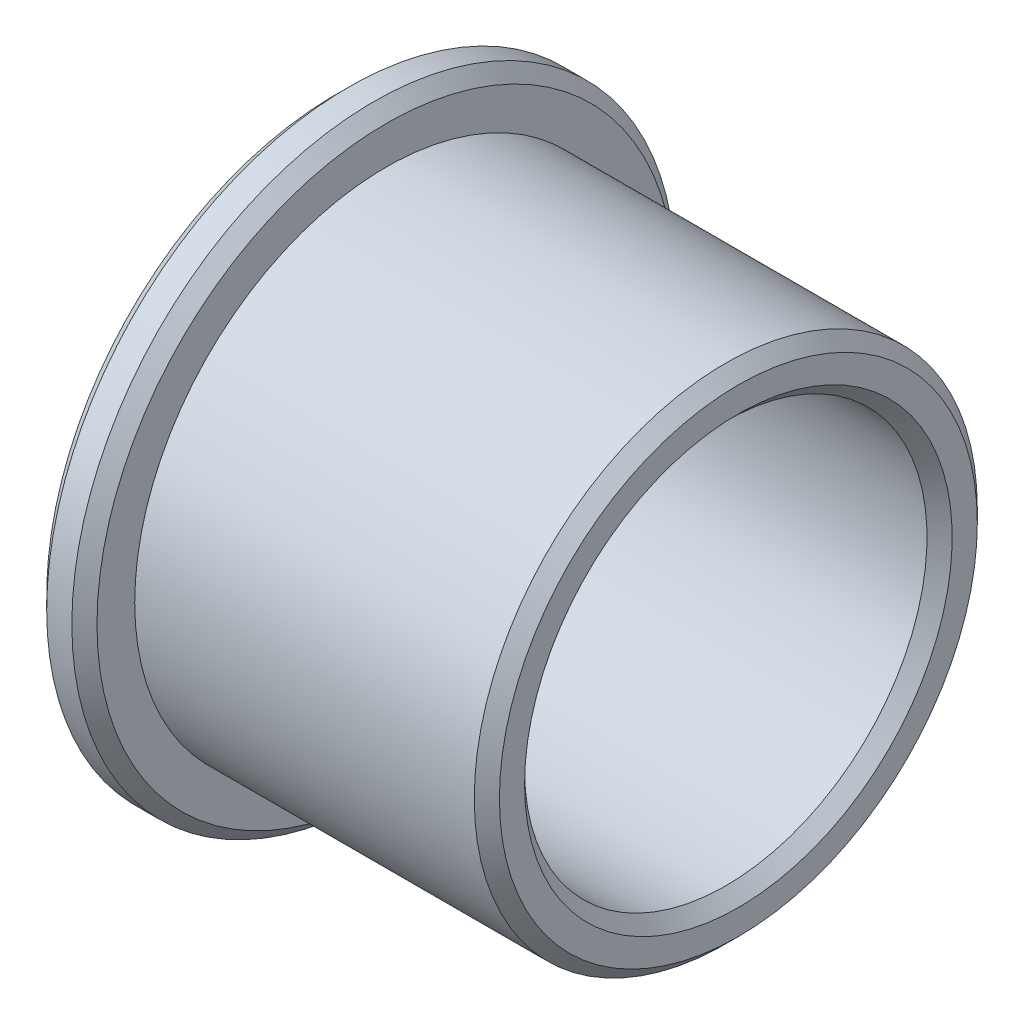
ISO-10303-21;
HEADER;
FILE_DESCRIPTION(('STEP AP214'),'2;1');
FILE_NAME('part.step','',(''),(''),'','','');
FILE_SCHEMA(('AUTOMOTIVE_DESIGN { 1 0 10303 214 1 1 1 1 }'));
ENDSEC;
DATA;
#1=APPLICATION_CONTEXT('core data for automotive mechanical design processes');
#2=APPLICATION_PROTOCOL_DEFINITION('international standard','automotive_design',2000,#1);
#3=PRODUCT_CONTEXT('',#1,'mechanical');
#4=PRODUCT('Part','Part','',(#3));
#5=PRODUCT_RELATED_PRODUCT_CATEGORY('part','',(#4));
#6=PRODUCT_DEFINITION_FORMATION('','',#4);
#7=PRODUCT_DEFINITION_CONTEXT('part definition',#1,'design');
#8=PRODUCT_DEFINITION('design','',#6,#7);
#9=PRODUCT_DEFINITION_SHAPE('','',#8);
#10=(LENGTH_UNIT() NAMED_UNIT(*) SI_UNIT(.MILLI.,.METRE.));
#11=(NAMED_UNIT(*) PLANE_ANGLE_UNIT() SI_UNIT($,.RADIAN.));
#12=(NAMED_UNIT(*) SI_UNIT($,.STERADIAN.) SOLID_ANGLE_UNIT());
#13=UNCERTAINTY_MEASURE_WITH_UNIT(LENGTH_MEASURE(1.E-05),#10,'distance_accuracy_value','');
#14=(GEOMETRIC_REPRESENTATION_CONTEXT(3) GLOBAL_UNCERTAINTY_ASSIGNED_CONTEXT((#13)) GLOBAL_UNIT_ASSIGNED_CONTEXT((#10,
#11,#12)) REPRESENTATION_CONTEXT('',''));
#15=CARTESIAN_POINT('',(0.,0.,0.));
#16=DIRECTION('',(0.,0.,1.));
#17=DIRECTION('',(1.,0.,0.));
#18=AXIS2_PLACEMENT_3D('',#15,#16,#17);
#19=CARTESIAN_POINT('',(8.,0.,-4.));
#20=DIRECTION('',(-1.,0.,0.));
#21=DIRECTION('',(0.,0.,1.));
#22=AXIS2_PLACEMENT_3D('',#19,#20,#21);
#23=PLANE('',#22);
#24=CARTESIAN_POINT('',(8.,0.,0.));
#25=DIRECTION('',(-1.,0.,0.));
#26=DIRECTION('',(0.,0.,1.));
#27=AXIS2_PLACEMENT_3D('',#24,#25,#26);
#28=CIRCLE('',#27,4.25);
#29=CARTESIAN_POINT('',(8.,0.,4.25));
#30=VERTEX_POINT('',#29);
#31=EDGE_CURVE('E37',#30,#30,#28,.T.);
#32=ORIENTED_EDGE('',*,*,#31,.T.);
#33=EDGE_LOOP('',(#32));
#34=FACE_BOUND('',#33,.T.);
#35=CARTESIAN_POINT('',(8.,0.,0.));
#36=DIRECTION('',(-1.,0.,0.));
#37=DIRECTION('',(0.,0.,1.));
#38=AXIS2_PLACEMENT_3D('',#35,#36,#37);
#39=CIRCLE('',#38,4.75);
#40=CARTESIAN_POINT('',(8.,0.,4.75));
#41=VERTEX_POINT('',#40);
#42=EDGE_CURVE('E41',#41,#41,#39,.F.);
#43=ORIENTED_EDGE('',*,*,#42,.T.);
#44=EDGE_LOOP('',(#43));
#45=FACE_BOUND('',#44,.T.);
#46=ADVANCED_FACE('F30',(#34,#45),#23,.F.);
#47=CARTESIAN_POINT('',(-2.31578947368421,0.,0.));
#48=DIRECTION('',(-1.,0.,0.));
#49=DIRECTION('',(0.,0.,1.));
#50=AXIS2_PLACEMENT_3D('',#47,#48,#49);
#51=CYLINDRICAL_SURFACE('',#50,5.);
#52=CARTESIAN_POINT('',(7.75,0.,0.));
#53=DIRECTION('',(-1.,0.,0.));
#54=DIRECTION('',(0.,0.,1.));
#55=AXIS2_PLACEMENT_3D('',#52,#53,#54);
#56=CIRCLE('',#55,5.);
#57=CARTESIAN_POINT('',(7.75,0.,5.));
#58=VERTEX_POINT('',#57);
#59=EDGE_CURVE('E10',#58,#58,#56,.T.);
#60=ORIENTED_EDGE('',*,*,#59,.T.);
#61=EDGE_LOOP('',(#60));
#62=FACE_BOUND('',#61,.T.);
#63=CARTESIAN_POINT('',(0.999999999999999,0.,0.));
#64=DIRECTION('',(-1.,0.,0.));
#65=DIRECTION('',(0.,0.,1.));
#66=AXIS2_PLACEMENT_3D('',#63,#64,#65);
#67=CIRCLE('',#66,5.);
#68=CARTESIAN_POINT('',(0.999999999999999,0.,5.));
#69=VERTEX_POINT('',#68);
#70=EDGE_CURVE('E68',#69,#69,#67,.T.);
#71=ORIENTED_EDGE('',*,*,#70,.F.);
#72=EDGE_LOOP('',(#71));
#73=FACE_BOUND('',#72,.T.);
#74=ADVANCED_FACE('F74',(#62,#73),#51,.T.);
#75=CARTESIAN_POINT('',(0.999999999999999,0.,-5.));
#76=DIRECTION('',(-1.,0.,0.));
#77=DIRECTION('',(0.,0.,1.));
#78=AXIS2_PLACEMENT_3D('',#75,#76,#77);
#79=PLANE('',#78);
#80=CARTESIAN_POINT('',(0.999999999999999,0.,0.));
#81=DIRECTION('',(-1.,0.,0.));
#82=DIRECTION('',(0.,0.,1.));
#83=AXIS2_PLACEMENT_3D('',#80,#81,#82);
#84=CIRCLE('',#83,5.75);
#85=CARTESIAN_POINT('',(0.999999999999999,0.,5.75));
#86=VERTEX_POINT('',#85);
#87=EDGE_CURVE('E53',#86,#86,#84,.F.);
#88=ORIENTED_EDGE('',*,*,#87,.T.);
#89=EDGE_LOOP('',(#88));
#90=FACE_BOUND('',#89,.T.);
#91=ORIENTED_EDGE('',*,*,#70,.T.);
#92=EDGE_LOOP('',(#91));
#93=FACE_BOUND('',#92,.T.);
#94=ADVANCED_FACE('F72',(#90,#93),#79,.F.);
#95=CARTESIAN_POINT('',(-2.31578947368421,0.,0.));
#96=DIRECTION('',(-1.,0.,0.));
#97=DIRECTION('',(0.,0.,1.));
#98=AXIS2_PLACEMENT_3D('',#95,#96,#97);
#99=CYLINDRICAL_SURFACE('',#98,6.);
#100=CARTESIAN_POINT('',(0.250000000000004,0.,0.));
#101=DIRECTION('',(1.,0.,0.));
#102=DIRECTION('',(0.,0.,-1.));
#103=AXIS2_PLACEMENT_3D('',#100,#101,#102);
#104=CIRCLE('',#103,6.);
#105=CARTESIAN_POINT('',(0.250000000000004,0.,-6.));
#106=VERTEX_POINT('',#105);
#107=EDGE_CURVE('E56',#106,#106,#104,.T.);
#108=ORIENTED_EDGE('',*,*,#107,.T.);
#109=EDGE_LOOP('',(#108));
#110=FACE_BOUND('',#109,.T.);
#111=CARTESIAN_POINT('',(0.750000000000005,0.,0.));
#112=DIRECTION('',(-1.,0.,0.));
#113=DIRECTION('',(0.,0.,1.));
#114=AXIS2_PLACEMENT_3D('',#111,#112,#113);
#115=CIRCLE('',#114,6.);
#116=CARTESIAN_POINT('',(0.750000000000005,0.,6.));
#117=VERTEX_POINT('',#116);
#118=EDGE_CURVE('E59',#117,#117,#115,.T.);
#119=ORIENTED_EDGE('',*,*,#118,.T.);
#120=EDGE_LOOP('',(#119));
#121=FACE_BOUND('',#120,.T.);
#122=ADVANCED_FACE('F81',(#110,#121),#99,.T.);
#123=CARTESIAN_POINT('',(0.,0.,-6.));
#124=DIRECTION('',(1.,0.,0.));
#125=DIRECTION('',(0.,0.,-1.));
#126=AXIS2_PLACEMENT_3D('',#123,#124,#125);
#127=PLANE('',#126);
#128=CARTESIAN_POINT('',(0.,0.,0.));
#129=DIRECTION('',(1.,0.,0.));
#130=DIRECTION('',(0.,0.,-1.));
#131=AXIS2_PLACEMENT_3D('',#128,#129,#130);
#132=CIRCLE('',#131,5.75);
#133=CARTESIAN_POINT('',(0.,0.,-5.75));
#134=VERTEX_POINT('',#133);
#135=EDGE_CURVE('E62',#134,#134,#132,.F.);
#136=ORIENTED_EDGE('',*,*,#135,.T.);
#137=EDGE_LOOP('',(#136));
#138=FACE_BOUND('',#137,.T.);
#139=CARTESIAN_POINT('',(0.,0.,0.));
#140=DIRECTION('',(1.,0.,0.));
#141=DIRECTION('',(0.,0.,-1.));
#142=AXIS2_PLACEMENT_3D('',#139,#140,#141);
#143=CIRCLE('',#142,4.25);
#144=CARTESIAN_POINT('',(0.,0.,-4.25));
#145=VERTEX_POINT('',#144);
#146=EDGE_CURVE('E65',#145,#145,#143,.T.);
#147=ORIENTED_EDGE('',*,*,#146,.T.);
#148=EDGE_LOOP('',(#147));
#149=FACE_BOUND('',#148,.T.);
#150=ADVANCED_FACE('F110',(#138,#149),#127,.F.);
#151=CARTESIAN_POINT('',(-2.31578947368421,0.,0.));
#152=DIRECTION('',(-1.,0.,0.));
#153=DIRECTION('',(0.,0.,1.));
#154=AXIS2_PLACEMENT_3D('',#151,#152,#153);
#155=CYLINDRICAL_SURFACE('',#154,4.);
#156=CARTESIAN_POINT('',(0.250000000000003,0.,0.));
#157=DIRECTION('',(1.,0.,0.));
#158=DIRECTION('',(0.,0.,-1.));
#159=AXIS2_PLACEMENT_3D('',#156,#157,#158);
#160=CIRCLE('',#159,4.);
#161=CARTESIAN_POINT('',(0.250000000000003,0.,-4.));
#162=VERTEX_POINT('',#161);
#163=EDGE_CURVE('E45',#162,#162,#160,.F.);
#164=ORIENTED_EDGE('',*,*,#163,.T.);
#165=EDGE_LOOP('',(#164));
#166=FACE_BOUND('',#165,.T.);
#167=CARTESIAN_POINT('',(7.75,0.,0.));
#168=DIRECTION('',(-1.,0.,0.));
#169=DIRECTION('',(0.,0.,1.));
#170=AXIS2_PLACEMENT_3D('',#167,#168,#169);
#171=CIRCLE('',#170,4.);
#172=CARTESIAN_POINT('',(7.75,0.,4.));
#173=VERTEX_POINT('',#172);
#174=EDGE_CURVE('E50',#173,#173,#171,.F.);
#175=ORIENTED_EDGE('',*,*,#174,.T.);
#176=EDGE_LOOP('',(#175));
#177=FACE_BOUND('',#176,.T.);
#178=ADVANCED_FACE('F91',(#166,#177),#155,.F.);
#179=CARTESIAN_POINT('',(0.,0.,0.));
#180=DIRECTION('',(1.,0.,0.));
#181=DIRECTION('',(0.,0.,-1.));
#182=AXIS2_PLACEMENT_3D('',#179,#180,#181);
#183=CONICAL_SURFACE('',#182,5.75,0.785398163397444);
#184=ORIENTED_EDGE('',*,*,#107,.F.);
#185=EDGE_LOOP('',(#184));
#186=FACE_BOUND('',#185,.T.);
#187=ORIENTED_EDGE('',*,*,#135,.F.);
#188=EDGE_LOOP('',(#187));
#189=FACE_BOUND('',#188,.T.);
#190=ADVANCED_FACE('F87',(#186,#189),#183,.T.);
#191=CARTESIAN_POINT('',(0.750000000000005,0.,0.));
#192=DIRECTION('',(-1.,0.,0.));
#193=DIRECTION('',(0.,0.,1.));
#194=AXIS2_PLACEMENT_3D('',#191,#192,#193);
#195=CONICAL_SURFACE('',#194,6.,0.785398163397452);
#196=ORIENTED_EDGE('',*,*,#87,.F.);
#197=EDGE_LOOP('',(#196));
#198=FACE_BOUND('',#197,.T.);
#199=ORIENTED_EDGE('',*,*,#118,.F.);
#200=EDGE_LOOP('',(#199));
#201=FACE_BOUND('',#200,.T.);
#202=ADVANCED_FACE('F90',(#198,#201),#195,.T.);
#203=CARTESIAN_POINT('',(0.250000000000003,0.,0.));
#204=DIRECTION('',(-1.,0.,0.));
#205=DIRECTION('',(0.,0.,1.));
#206=AXIS2_PLACEMENT_3D('',#203,#204,#205);
#207=CONICAL_SURFACE('',#206,4.,0.785398163397447);
#208=ORIENTED_EDGE('',*,*,#146,.F.);
#209=EDGE_LOOP('',(#208));
#210=FACE_BOUND('',#209,.T.);
#211=ORIENTED_EDGE('',*,*,#163,.F.);
#212=EDGE_LOOP('',(#211));
#213=FACE_BOUND('',#212,.T.);
#214=ADVANCED_FACE('F95',(#210,#213),#207,.F.);
#215=CARTESIAN_POINT('',(8.,0.,0.));
#216=DIRECTION('',(1.,0.,0.));
#217=DIRECTION('',(0.,0.,-1.));
#218=AXIS2_PLACEMENT_3D('',#215,#216,#217);
#219=CONICAL_SURFACE('',#218,4.25,0.785398163397445);
#220=ORIENTED_EDGE('',*,*,#174,.F.);
#221=EDGE_LOOP('',(#220));
#222=FACE_BOUND('',#221,.T.);
#223=ORIENTED_EDGE('',*,*,#31,.F.);
#224=EDGE_LOOP('',(#223));
#225=FACE_BOUND('',#224,.T.);
#226=ADVANCED_FACE('F98',(#222,#225),#219,.F.);
#227=CARTESIAN_POINT('',(7.75,0.,0.));
#228=DIRECTION('',(-1.,0.,0.));
#229=DIRECTION('',(0.,0.,1.));
#230=AXIS2_PLACEMENT_3D('',#227,#228,#229);
#231=CONICAL_SURFACE('',#230,5.,0.785398163397453);
#232=ORIENTED_EDGE('',*,*,#42,.F.);
#233=EDGE_LOOP('',(#232));
#234=FACE_BOUND('',#233,.T.);
#235=ORIENTED_EDGE('',*,*,#59,.F.);
#236=EDGE_LOOP('',(#235));
#237=FACE_BOUND('',#236,.T.);
#238=ADVANCED_FACE('F32',(#234,#237),#231,.T.);
#239=CLOSED_SHELL('',(#46,#74,#94,#122,#150,#178,#190,#202,#214,#226,#238));
#240=MANIFOLD_SOLID_BREP('B2',#239);
#241=ADVANCED_BREP_SHAPE_REPRESENTATION('',(#18,#240),#14);
#242=SHAPE_DEFINITION_REPRESENTATION(#9,#241);
ENDSEC;
END-ISO-10303-21;
